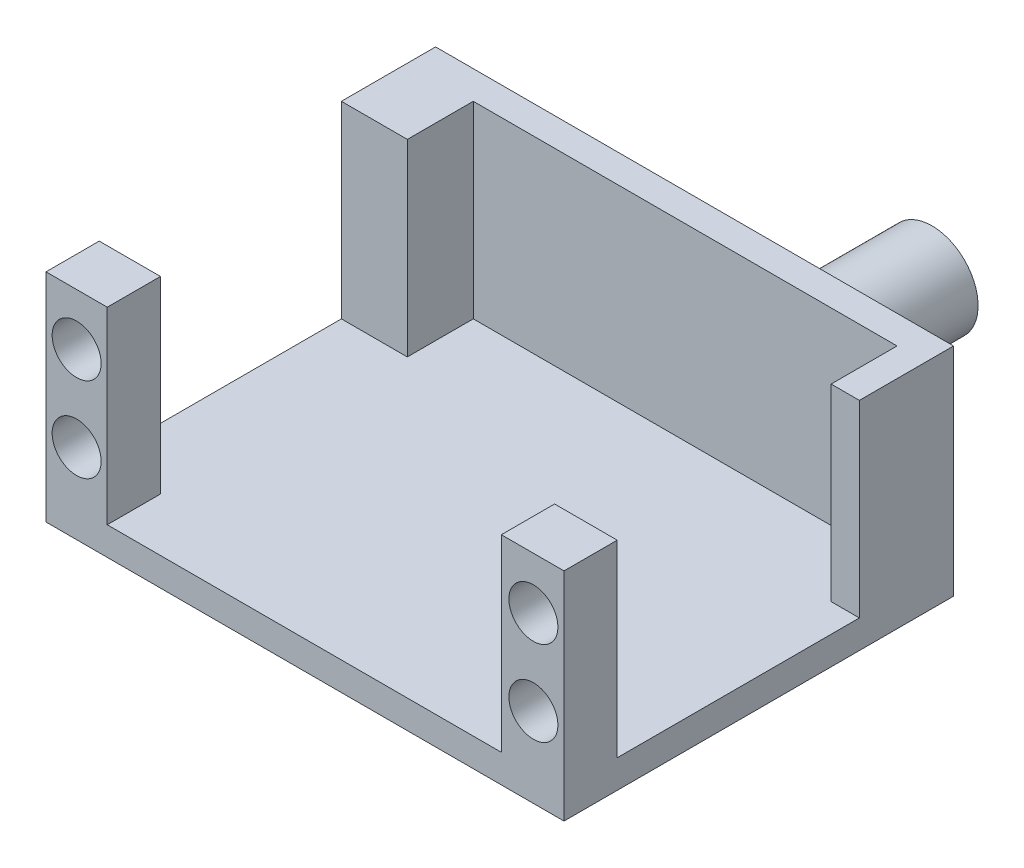
ISO-10303-21;
HEADER;
FILE_DESCRIPTION(('STEP AP214'),'2;1');
FILE_NAME('part.step','',(''),(''),'','','');
FILE_SCHEMA(('AUTOMOTIVE_DESIGN { 1 0 10303 214 1 1 1 1 }'));
ENDSEC;
DATA;
#1=APPLICATION_CONTEXT('core data for automotive mechanical design processes');
#2=APPLICATION_PROTOCOL_DEFINITION('international standard','automotive_design',2000,#1);
#3=PRODUCT_CONTEXT('',#1,'mechanical');
#4=PRODUCT('Part','Part','',(#3));
#5=PRODUCT_RELATED_PRODUCT_CATEGORY('part','',(#4));
#6=PRODUCT_DEFINITION_FORMATION('','',#4);
#7=PRODUCT_DEFINITION_CONTEXT('part definition',#1,'design');
#8=PRODUCT_DEFINITION('design','',#6,#7);
#9=PRODUCT_DEFINITION_SHAPE('','',#8);
#10=(LENGTH_UNIT() NAMED_UNIT(*) SI_UNIT(.MILLI.,.METRE.));
#11=(NAMED_UNIT(*) PLANE_ANGLE_UNIT() SI_UNIT($,.RADIAN.));
#12=(NAMED_UNIT(*) SI_UNIT($,.STERADIAN.) SOLID_ANGLE_UNIT());
#13=UNCERTAINTY_MEASURE_WITH_UNIT(LENGTH_MEASURE(1.E-05),#10,'distance_accuracy_value','');
#14=(GEOMETRIC_REPRESENTATION_CONTEXT(3) GLOBAL_UNCERTAINTY_ASSIGNED_CONTEXT((#13)) GLOBAL_UNIT_ASSIGNED_CONTEXT((#10,
#11,#12)) REPRESENTATION_CONTEXT('',''));
#15=CARTESIAN_POINT('',(0.,0.,0.));
#16=DIRECTION('',(0.,0.,1.));
#17=DIRECTION('',(1.,0.,0.));
#18=AXIS2_PLACEMENT_3D('',#15,#16,#17);
#19=CARTESIAN_POINT('',(0.,3.,0.));
#20=DIRECTION('',(0.,-1.,0.));
#21=DIRECTION('',(0.,0.,-1.));
#22=AXIS2_PLACEMENT_3D('',#19,#20,#21);
#23=PLANE('',#22);
#24=DIRECTION('',(1.,0.,0.));
#25=VECTOR('',#24,1.);
#26=CARTESIAN_POINT('',(27.49,3.,-7.675));
#27=LINE('',#26,#25);
#28=CARTESIAN_POINT('',(24.49,3.,-7.675));
#29=VERTEX_POINT('',#28);
#30=CARTESIAN_POINT('',(27.49,3.,-7.675));
#31=VERTEX_POINT('',#30);
#32=EDGE_CURVE('E54',#29,#31,#27,.T.);
#33=ORIENTED_EDGE('',*,*,#32,.F.);
#34=DIRECTION('',(0.,0.,1.));
#35=VECTOR('',#34,1.);
#36=CARTESIAN_POINT('',(24.49,3.,-14.675));
#37=LINE('',#36,#35);
#38=CARTESIAN_POINT('',(24.49,3.,-14.675));
#39=VERTEX_POINT('',#38);
#40=EDGE_CURVE('E56',#39,#29,#37,.T.);
#41=ORIENTED_EDGE('',*,*,#40,.F.);
#42=DIRECTION('',(1.,0.,0.));
#43=VECTOR('',#42,1.);
#44=CARTESIAN_POINT('',(-20.49,3.,-14.675));
#45=LINE('',#44,#43);
#46=CARTESIAN_POINT('',(-20.49,3.,-14.675));
#47=VERTEX_POINT('',#46);
#48=EDGE_CURVE('E208',#47,#39,#45,.T.);
#49=ORIENTED_EDGE('',*,*,#48,.F.);
#50=DIRECTION('',(0.,0.,-1.));
#51=VECTOR('',#50,1.);
#52=CARTESIAN_POINT('',(-20.49,3.,-7.675));
#53=LINE('',#52,#51);
#54=CARTESIAN_POINT('',(-20.49,3.,-7.675));
#55=VERTEX_POINT('',#54);
#56=EDGE_CURVE('E214',#55,#47,#53,.T.);
#57=ORIENTED_EDGE('',*,*,#56,.F.);
#58=DIRECTION('',(1.,0.,0.));
#59=VECTOR('',#58,1.);
#60=CARTESIAN_POINT('',(-27.49,3.,-7.675));
#61=LINE('',#60,#59);
#62=CARTESIAN_POINT('',(-27.49,3.,-7.675));
#63=VERTEX_POINT('',#62);
#64=EDGE_CURVE('E180',#63,#55,#61,.T.);
#65=ORIENTED_EDGE('',*,*,#64,.F.);
#66=DIRECTION('',(0.,0.,1.));
#67=VECTOR('',#66,1.);
#68=CARTESIAN_POINT('',(-27.49,3.,23.675));
#69=LINE('',#68,#67);
#70=CARTESIAN_POINT('',(-27.49,3.,18.025));
#71=VERTEX_POINT('',#70);
#72=EDGE_CURVE('E256',#63,#71,#69,.T.);
#73=ORIENTED_EDGE('',*,*,#72,.T.);
#74=DIRECTION('',(-1.,0.,0.));
#75=VECTOR('',#74,1.);
#76=CARTESIAN_POINT('',(-27.49,3.,18.025));
#77=LINE('',#76,#75);
#78=CARTESIAN_POINT('',(-20.99,3.,18.025));
#79=VERTEX_POINT('',#78);
#80=EDGE_CURVE('E238',#79,#71,#77,.T.);
#81=ORIENTED_EDGE('',*,*,#80,.F.);
#82=DIRECTION('',(0.,0.,-1.));
#83=VECTOR('',#82,1.);
#84=CARTESIAN_POINT('',(-20.99,3.,23.675));
#85=LINE('',#84,#83);
#86=CARTESIAN_POINT('',(-20.99,3.,23.675));
#87=VERTEX_POINT('',#86);
#88=EDGE_CURVE('E169',#87,#79,#85,.T.);
#89=ORIENTED_EDGE('',*,*,#88,.F.);
#90=DIRECTION('',(1.,0.,0.));
#91=VECTOR('',#90,1.);
#92=CARTESIAN_POINT('',(-27.49,3.,23.675));
#93=LINE('',#92,#91);
#94=CARTESIAN_POINT('',(20.84,3.,23.675));
#95=VERTEX_POINT('',#94);
#96=EDGE_CURVE('E151',#87,#95,#93,.T.);
#97=ORIENTED_EDGE('',*,*,#96,.T.);
#98=DIRECTION('',(0.,0.,1.));
#99=VECTOR('',#98,1.);
#100=CARTESIAN_POINT('',(20.84,3.,23.675));
#101=LINE('',#100,#99);
#102=CARTESIAN_POINT('',(20.84,3.,18.025));
#103=VERTEX_POINT('',#102);
#104=EDGE_CURVE('E150',#103,#95,#101,.T.);
#105=ORIENTED_EDGE('',*,*,#104,.F.);
#106=DIRECTION('',(-1.,0.,0.));
#107=VECTOR('',#106,1.);
#108=CARTESIAN_POINT('',(27.49,3.,18.025));
#109=LINE('',#108,#107);
#110=CARTESIAN_POINT('',(27.49,3.,18.025));
#111=VERTEX_POINT('',#110);
#112=EDGE_CURVE('E152',#111,#103,#109,.T.);
#113=ORIENTED_EDGE('',*,*,#112,.F.);
#114=DIRECTION('',(0.,0.,-1.));
#115=VECTOR('',#114,1.);
#116=CARTESIAN_POINT('',(27.49,3.,23.675));
#117=LINE('',#116,#115);
#118=EDGE_CURVE('E257',#111,#31,#117,.T.);
#119=ORIENTED_EDGE('',*,*,#118,.T.);
#120=EDGE_LOOP('',(#33,#41,#49,#57,#65,#73,#81,#89,#97,#105,#113,#119));
#121=FACE_BOUND('',#120,.T.);
#122=ADVANCED_FACE('F39',(#121),#23,.F.);
#123=CARTESIAN_POINT('',(27.49,3.,23.675));
#124=DIRECTION('',(-1.,0.,0.));
#125=DIRECTION('',(0.,0.,1.));
#126=AXIS2_PLACEMENT_3D('',#123,#124,#125);
#127=PLANE('',#126);
#128=DIRECTION('',(0.,0.,-1.));
#129=VECTOR('',#128,1.);
#130=CARTESIAN_POINT('',(27.49,0.,23.675));
#131=LINE('',#130,#129);
#132=CARTESIAN_POINT('',(27.49,0.,23.675));
#133=VERTEX_POINT('',#132);
#134=CARTESIAN_POINT('',(27.49,0.,-17.675));
#135=VERTEX_POINT('',#134);
#136=EDGE_CURVE('E259',#133,#135,#131,.T.);
#137=ORIENTED_EDGE('',*,*,#136,.T.);
#138=DIRECTION('',(0.,-1.,0.));
#139=VECTOR('',#138,1.);
#140=CARTESIAN_POINT('',(27.49,3.,-17.675));
#141=LINE('',#140,#139);
#142=CARTESIAN_POINT('',(27.49,23.,-17.675));
#143=VERTEX_POINT('',#142);
#144=EDGE_CURVE('E43',#143,#135,#141,.T.);
#145=ORIENTED_EDGE('',*,*,#144,.F.);
#146=DIRECTION('',(0.,0.,-1.));
#147=VECTOR('',#146,1.);
#148=CARTESIAN_POINT('',(27.49,23.,-17.675));
#149=LINE('',#148,#147);
#150=CARTESIAN_POINT('',(27.49,23.,-7.675));
#151=VERTEX_POINT('',#150);
#152=EDGE_CURVE('E216',#151,#143,#149,.T.);
#153=ORIENTED_EDGE('',*,*,#152,.F.);
#154=DIRECTION('',(0.,-1.,0.));
#155=VECTOR('',#154,1.);
#156=CARTESIAN_POINT('',(27.49,23.,-7.675));
#157=LINE('',#156,#155);
#158=EDGE_CURVE('E205',#151,#31,#157,.T.);
#159=ORIENTED_EDGE('',*,*,#158,.T.);
#160=ORIENTED_EDGE('',*,*,#118,.F.);
#161=DIRECTION('',(0.,-1.,0.));
#162=VECTOR('',#161,1.);
#163=CARTESIAN_POINT('',(27.49,23.,18.025));
#164=LINE('',#163,#162);
#165=CARTESIAN_POINT('',(27.49,23.,18.025));
#166=VERTEX_POINT('',#165);
#167=EDGE_CURVE('E166',#166,#111,#164,.T.);
#168=ORIENTED_EDGE('',*,*,#167,.F.);
#169=DIRECTION('',(0.,0.,-1.));
#170=VECTOR('',#169,1.);
#171=CARTESIAN_POINT('',(27.49,23.,23.675));
#172=LINE('',#171,#170);
#173=CARTESIAN_POINT('',(27.49,23.,23.675));
#174=VERTEX_POINT('',#173);
#175=EDGE_CURVE('E156',#174,#166,#172,.T.);
#176=ORIENTED_EDGE('',*,*,#175,.F.);
#177=DIRECTION('',(0.,-1.,0.));
#178=VECTOR('',#177,1.);
#179=CARTESIAN_POINT('',(27.49,3.,23.675));
#180=LINE('',#179,#178);
#181=EDGE_CURVE('E261',#174,#133,#180,.T.);
#182=ORIENTED_EDGE('',*,*,#181,.T.);
#183=EDGE_LOOP('',(#137,#145,#153,#159,#160,#168,#176,#182));
#184=FACE_BOUND('',#183,.T.);
#185=ADVANCED_FACE('F41',(#184),#127,.F.);
#186=CARTESIAN_POINT('',(-27.49,3.,-17.675));
#187=DIRECTION('',(0.,0.,1.));
#188=DIRECTION('',(1.,0.,0.));
#189=AXIS2_PLACEMENT_3D('',#186,#187,#188);
#190=PLANE('',#189);
#191=CARTESIAN_POINT('',(10.19,13.,-17.675));
#192=DIRECTION('',(0.,0.,-1.));
#193=DIRECTION('',(-1.,0.,0.));
#194=AXIS2_PLACEMENT_3D('',#191,#192,#193);
#195=CIRCLE('',#194,4.9);
#196=CARTESIAN_POINT('',(5.29,13.,-17.675));
#197=VERTEX_POINT('',#196);
#198=EDGE_CURVE('E11',#197,#197,#195,.T.);
#199=ORIENTED_EDGE('',*,*,#198,.F.);
#200=EDGE_LOOP('',(#199));
#201=FACE_BOUND('',#200,.T.);
#202=DIRECTION('',(-1.,0.,0.));
#203=VECTOR('',#202,1.);
#204=CARTESIAN_POINT('',(-27.49,0.,-17.675));
#205=LINE('',#204,#203);
#206=CARTESIAN_POINT('',(-27.49,0.,-17.675));
#207=VERTEX_POINT('',#206);
#208=EDGE_CURVE('E269',#135,#207,#205,.T.);
#209=ORIENTED_EDGE('',*,*,#208,.T.);
#210=DIRECTION('',(0.,-1.,0.));
#211=VECTOR('',#210,1.);
#212=CARTESIAN_POINT('',(-27.49,3.,-17.675));
#213=LINE('',#212,#211);
#214=CARTESIAN_POINT('',(-27.49,23.,-17.675));
#215=VERTEX_POINT('',#214);
#216=EDGE_CURVE('E278',#215,#207,#213,.T.);
#217=ORIENTED_EDGE('',*,*,#216,.F.);
#218=DIRECTION('',(-1.,0.,0.));
#219=VECTOR('',#218,1.);
#220=CARTESIAN_POINT('',(-27.49,23.,-17.675));
#221=LINE('',#220,#219);
#222=EDGE_CURVE('E207',#143,#215,#221,.T.);
#223=ORIENTED_EDGE('',*,*,#222,.F.);
#224=ORIENTED_EDGE('',*,*,#144,.T.);
#225=EDGE_LOOP('',(#209,#217,#223,#224));
#226=FACE_BOUND('',#225,.T.);
#227=ADVANCED_FACE('F281',(#201,#226),#190,.F.);
#228=CARTESIAN_POINT('',(-27.49,3.,23.675));
#229=DIRECTION('',(1.,0.,0.));
#230=DIRECTION('',(0.,0.,-1.));
#231=AXIS2_PLACEMENT_3D('',#228,#229,#230);
#232=PLANE('',#231);
#233=DIRECTION('',(0.,0.,1.));
#234=VECTOR('',#233,1.);
#235=CARTESIAN_POINT('',(-27.49,0.,23.675));
#236=LINE('',#235,#234);
#237=CARTESIAN_POINT('',(-27.49,0.,23.675));
#238=VERTEX_POINT('',#237);
#239=EDGE_CURVE('E266',#207,#238,#236,.T.);
#240=ORIENTED_EDGE('',*,*,#239,.T.);
#241=DIRECTION('',(0.,-1.,0.));
#242=VECTOR('',#241,1.);
#243=CARTESIAN_POINT('',(-27.49,3.,23.675));
#244=LINE('',#243,#242);
#245=CARTESIAN_POINT('',(-27.49,23.,23.675));
#246=VERTEX_POINT('',#245);
#247=EDGE_CURVE('E274',#246,#238,#244,.T.);
#248=ORIENTED_EDGE('',*,*,#247,.F.);
#249=DIRECTION('',(0.,0.,1.));
#250=VECTOR('',#249,1.);
#251=CARTESIAN_POINT('',(-27.49,23.,23.675));
#252=LINE('',#251,#250);
#253=CARTESIAN_POINT('',(-27.49,23.,18.025));
#254=VERTEX_POINT('',#253);
#255=EDGE_CURVE('E234',#254,#246,#252,.T.);
#256=ORIENTED_EDGE('',*,*,#255,.F.);
#257=DIRECTION('',(0.,-1.,0.));
#258=VECTOR('',#257,1.);
#259=CARTESIAN_POINT('',(-27.49,23.,18.025));
#260=LINE('',#259,#258);
#261=EDGE_CURVE('E242',#254,#71,#260,.T.);
#262=ORIENTED_EDGE('',*,*,#261,.T.);
#263=ORIENTED_EDGE('',*,*,#72,.F.);
#264=DIRECTION('',(0.,-1.,0.));
#265=VECTOR('',#264,1.);
#266=CARTESIAN_POINT('',(-27.49,23.,-7.675));
#267=LINE('',#266,#265);
#268=CARTESIAN_POINT('',(-27.49,23.,-7.675));
#269=VERTEX_POINT('',#268);
#270=EDGE_CURVE('E190',#269,#63,#267,.T.);
#271=ORIENTED_EDGE('',*,*,#270,.F.);
#272=DIRECTION('',(0.,0.,1.));
#273=VECTOR('',#272,1.);
#274=CARTESIAN_POINT('',(-27.49,23.,-7.675));
#275=LINE('',#274,#273);
#276=EDGE_CURVE('E206',#215,#269,#275,.T.);
#277=ORIENTED_EDGE('',*,*,#276,.F.);
#278=ORIENTED_EDGE('',*,*,#216,.T.);
#279=EDGE_LOOP('',(#240,#248,#256,#262,#263,#271,#277,#278));
#280=FACE_BOUND('',#279,.T.);
#281=ADVANCED_FACE('F292',(#280),#232,.F.);
#282=CARTESIAN_POINT('',(-27.49,3.,23.675));
#283=DIRECTION('',(0.,0.,-1.));
#284=DIRECTION('',(-1.,0.,0.));
#285=AXIS2_PLACEMENT_3D('',#282,#283,#284);
#286=PLANE('',#285);
#287=CARTESIAN_POINT('',(-24.24,8.5,23.675));
#288=DIRECTION('',(0.,0.,1.));
#289=DIRECTION('',(1.,0.,0.));
#290=AXIS2_PLACEMENT_3D('',#287,#288,#289);
#291=CIRCLE('',#290,2.6);
#292=CARTESIAN_POINT('',(-21.64,8.5,23.675));
#293=VERTEX_POINT('',#292);
#294=EDGE_CURVE('E484',#293,#293,#291,.T.);
#295=ORIENTED_EDGE('',*,*,#294,.F.);
#296=EDGE_LOOP('',(#295));
#297=FACE_BOUND('',#296,.T.);
#298=CARTESIAN_POINT('',(24.24,17.5,23.675));
#299=DIRECTION('',(0.,0.,1.));
#300=DIRECTION('',(1.,0.,0.));
#301=AXIS2_PLACEMENT_3D('',#298,#299,#300);
#302=CIRCLE('',#301,2.6);
#303=CARTESIAN_POINT('',(26.84,17.5,23.675));
#304=VERTEX_POINT('',#303);
#305=EDGE_CURVE('E488',#304,#304,#302,.T.);
#306=ORIENTED_EDGE('',*,*,#305,.F.);
#307=EDGE_LOOP('',(#306));
#308=FACE_BOUND('',#307,.T.);
#309=CARTESIAN_POINT('',(24.24,8.5,23.675));
#310=DIRECTION('',(0.,0.,1.));
#311=DIRECTION('',(1.,0.,0.));
#312=AXIS2_PLACEMENT_3D('',#309,#310,#311);
#313=CIRCLE('',#312,2.6);
#314=CARTESIAN_POINT('',(26.84,8.5,23.675));
#315=VERTEX_POINT('',#314);
#316=EDGE_CURVE('E494',#315,#315,#313,.T.);
#317=ORIENTED_EDGE('',*,*,#316,.F.);
#318=EDGE_LOOP('',(#317));
#319=FACE_BOUND('',#318,.T.);
#320=CARTESIAN_POINT('',(-24.24,17.5,23.675));
#321=DIRECTION('',(0.,0.,1.));
#322=DIRECTION('',(1.,0.,0.));
#323=AXIS2_PLACEMENT_3D('',#320,#321,#322);
#324=CIRCLE('',#323,2.6);
#325=CARTESIAN_POINT('',(-21.64,17.5,23.675));
#326=VERTEX_POINT('',#325);
#327=EDGE_CURVE('E486',#326,#326,#324,.T.);
#328=ORIENTED_EDGE('',*,*,#327,.F.);
#329=EDGE_LOOP('',(#328));
#330=FACE_BOUND('',#329,.T.);
#331=DIRECTION('',(1.,0.,0.));
#332=VECTOR('',#331,1.);
#333=CARTESIAN_POINT('',(-27.49,0.,23.675));
#334=LINE('',#333,#332);
#335=EDGE_CURVE('E262',#238,#133,#334,.T.);
#336=ORIENTED_EDGE('',*,*,#335,.T.);
#337=ORIENTED_EDGE('',*,*,#181,.F.);
#338=DIRECTION('',(1.,0.,0.));
#339=VECTOR('',#338,1.);
#340=CARTESIAN_POINT('',(27.49,23.,23.675));
#341=LINE('',#340,#339);
#342=CARTESIAN_POINT('',(20.84,23.,23.675));
#343=VERTEX_POINT('',#342);
#344=EDGE_CURVE('E174',#343,#174,#341,.T.);
#345=ORIENTED_EDGE('',*,*,#344,.F.);
#346=DIRECTION('',(0.,-1.,0.));
#347=VECTOR('',#346,1.);
#348=CARTESIAN_POINT('',(20.84,23.,23.675));
#349=LINE('',#348,#347);
#350=EDGE_CURVE('E173',#343,#95,#349,.T.);
#351=ORIENTED_EDGE('',*,*,#350,.T.);
#352=ORIENTED_EDGE('',*,*,#96,.F.);
#353=DIRECTION('',(0.,-1.,0.));
#354=VECTOR('',#353,1.);
#355=CARTESIAN_POINT('',(-20.99,23.,23.675));
#356=LINE('',#355,#354);
#357=CARTESIAN_POINT('',(-20.99,23.,23.675));
#358=VERTEX_POINT('',#357);
#359=EDGE_CURVE('E251',#358,#87,#356,.T.);
#360=ORIENTED_EDGE('',*,*,#359,.F.);
#361=DIRECTION('',(1.,0.,0.));
#362=VECTOR('',#361,1.);
#363=CARTESIAN_POINT('',(-27.49,23.,23.675));
#364=LINE('',#363,#362);
#365=EDGE_CURVE('E240',#246,#358,#364,.T.);
#366=ORIENTED_EDGE('',*,*,#365,.F.);
#367=ORIENTED_EDGE('',*,*,#247,.T.);
#368=EDGE_LOOP('',(#336,#337,#345,#351,#352,#360,#366,#367));
#369=FACE_BOUND('',#368,.T.);
#370=ADVANCED_FACE('F298',(#297,#308,#319,#330,#369),#286,.F.);
#371=CARTESIAN_POINT('',(0.,0.,0.));
#372=DIRECTION('',(0.,-1.,0.));
#373=DIRECTION('',(0.,0.,-1.));
#374=AXIS2_PLACEMENT_3D('',#371,#372,#373);
#375=PLANE('',#374);
#376=ORIENTED_EDGE('',*,*,#136,.F.);
#377=ORIENTED_EDGE('',*,*,#335,.F.);
#378=ORIENTED_EDGE('',*,*,#239,.F.);
#379=ORIENTED_EDGE('',*,*,#208,.F.);
#380=EDGE_LOOP('',(#376,#377,#378,#379));
#381=FACE_BOUND('',#380,.T.);
#382=ADVANCED_FACE('F293',(#381),#375,.T.);
#383=CARTESIAN_POINT('',(-20.99,23.,23.675));
#384=DIRECTION('',(-1.,0.,0.));
#385=DIRECTION('',(0.,0.,1.));
#386=AXIS2_PLACEMENT_3D('',#383,#384,#385);
#387=PLANE('',#386);
#388=ORIENTED_EDGE('',*,*,#88,.T.);
#389=DIRECTION('',(0.,-1.,0.));
#390=VECTOR('',#389,1.);
#391=CARTESIAN_POINT('',(-20.99,23.,18.025));
#392=LINE('',#391,#390);
#393=CARTESIAN_POINT('',(-20.99,23.,18.025));
#394=VERTEX_POINT('',#393);
#395=EDGE_CURVE('E252',#394,#79,#392,.T.);
#396=ORIENTED_EDGE('',*,*,#395,.F.);
#397=DIRECTION('',(0.,0.,-1.));
#398=VECTOR('',#397,1.);
#399=CARTESIAN_POINT('',(-20.99,23.,23.675));
#400=LINE('',#399,#398);
#401=EDGE_CURVE('E239',#358,#394,#400,.T.);
#402=ORIENTED_EDGE('',*,*,#401,.F.);
#403=ORIENTED_EDGE('',*,*,#359,.T.);
#404=EDGE_LOOP('',(#388,#396,#402,#403));
#405=FACE_BOUND('',#404,.T.);
#406=ADVANCED_FACE('F307',(#405),#387,.F.);
#407=CARTESIAN_POINT('',(-27.49,23.,18.025));
#408=DIRECTION('',(0.,0.,1.));
#409=DIRECTION('',(1.,0.,0.));
#410=AXIS2_PLACEMENT_3D('',#407,#408,#409);
#411=PLANE('',#410);
#412=CARTESIAN_POINT('',(-24.24,8.5,18.025));
#413=DIRECTION('',(0.,0.,1.));
#414=DIRECTION('',(1.,0.,0.));
#415=AXIS2_PLACEMENT_3D('',#412,#413,#414);
#416=CIRCLE('',#415,2.6);
#417=CARTESIAN_POINT('',(-21.64,8.5,18.025));
#418=VERTEX_POINT('',#417);
#419=EDGE_CURVE('E483',#418,#418,#416,.F.);
#420=ORIENTED_EDGE('',*,*,#419,.F.);
#421=EDGE_LOOP('',(#420));
#422=FACE_BOUND('',#421,.T.);
#423=CARTESIAN_POINT('',(-24.24,17.5,18.025));
#424=DIRECTION('',(0.,0.,1.));
#425=DIRECTION('',(1.,0.,0.));
#426=AXIS2_PLACEMENT_3D('',#423,#424,#425);
#427=CIRCLE('',#426,2.6);
#428=CARTESIAN_POINT('',(-21.64,17.5,18.025));
#429=VERTEX_POINT('',#428);
#430=EDGE_CURVE('E501',#429,#429,#427,.F.);
#431=ORIENTED_EDGE('',*,*,#430,.F.);
#432=EDGE_LOOP('',(#431));
#433=FACE_BOUND('',#432,.T.);
#434=ORIENTED_EDGE('',*,*,#80,.T.);
#435=ORIENTED_EDGE('',*,*,#261,.F.);
#436=DIRECTION('',(-1.,0.,0.));
#437=VECTOR('',#436,1.);
#438=CARTESIAN_POINT('',(-27.49,23.,18.025));
#439=LINE('',#438,#437);
#440=EDGE_CURVE('E245',#394,#254,#439,.T.);
#441=ORIENTED_EDGE('',*,*,#440,.F.);
#442=ORIENTED_EDGE('',*,*,#395,.T.);
#443=EDGE_LOOP('',(#434,#435,#441,#442));
#444=FACE_BOUND('',#443,.T.);
#445=ADVANCED_FACE('F306',(#422,#433,#444),#411,.F.);
#446=CARTESIAN_POINT('',(0.,23.,0.));
#447=DIRECTION('',(0.,-1.,0.));
#448=DIRECTION('',(0.,0.,-1.));
#449=AXIS2_PLACEMENT_3D('',#446,#447,#448);
#450=PLANE('',#449);
#451=ORIENTED_EDGE('',*,*,#255,.T.);
#452=ORIENTED_EDGE('',*,*,#365,.T.);
#453=ORIENTED_EDGE('',*,*,#401,.T.);
#454=ORIENTED_EDGE('',*,*,#440,.T.);
#455=EDGE_LOOP('',(#451,#452,#453,#454));
#456=FACE_BOUND('',#455,.T.);
#457=ADVANCED_FACE('F297',(#456),#450,.F.);
#458=CARTESIAN_POINT('',(27.49,23.,18.025));
#459=DIRECTION('',(0.,0.,1.));
#460=DIRECTION('',(1.,0.,0.));
#461=AXIS2_PLACEMENT_3D('',#458,#459,#460);
#462=PLANE('',#461);
#463=CARTESIAN_POINT('',(24.24,17.5,18.025));
#464=DIRECTION('',(0.,0.,1.));
#465=DIRECTION('',(1.,0.,0.));
#466=AXIS2_PLACEMENT_3D('',#463,#464,#465);
#467=CIRCLE('',#466,2.6);
#468=CARTESIAN_POINT('',(26.84,17.5,18.025));
#469=VERTEX_POINT('',#468);
#470=EDGE_CURVE('E493',#469,#469,#467,.F.);
#471=ORIENTED_EDGE('',*,*,#470,.F.);
#472=EDGE_LOOP('',(#471));
#473=FACE_BOUND('',#472,.T.);
#474=CARTESIAN_POINT('',(24.24,8.5,18.025));
#475=DIRECTION('',(0.,0.,1.));
#476=DIRECTION('',(1.,0.,0.));
#477=AXIS2_PLACEMENT_3D('',#474,#475,#476);
#478=CIRCLE('',#477,2.6);
#479=CARTESIAN_POINT('',(26.84,8.5,18.025));
#480=VERTEX_POINT('',#479);
#481=EDGE_CURVE('E514',#480,#480,#478,.F.);
#482=ORIENTED_EDGE('',*,*,#481,.F.);
#483=EDGE_LOOP('',(#482));
#484=FACE_BOUND('',#483,.T.);
#485=ORIENTED_EDGE('',*,*,#112,.T.);
#486=DIRECTION('',(0.,-1.,0.));
#487=VECTOR('',#486,1.);
#488=CARTESIAN_POINT('',(20.84,23.,18.025));
#489=LINE('',#488,#487);
#490=CARTESIAN_POINT('',(20.84,23.,18.025));
#491=VERTEX_POINT('',#490);
#492=EDGE_CURVE('E164',#491,#103,#489,.T.);
#493=ORIENTED_EDGE('',*,*,#492,.F.);
#494=DIRECTION('',(-1.,0.,0.));
#495=VECTOR('',#494,1.);
#496=CARTESIAN_POINT('',(27.49,23.,18.025));
#497=LINE('',#496,#495);
#498=EDGE_CURVE('E182',#166,#491,#497,.T.);
#499=ORIENTED_EDGE('',*,*,#498,.F.);
#500=ORIENTED_EDGE('',*,*,#167,.T.);
#501=EDGE_LOOP('',(#485,#493,#499,#500));
#502=FACE_BOUND('',#501,.T.);
#503=ADVANCED_FACE('F165',(#473,#484,#502),#462,.F.);
#504=CARTESIAN_POINT('',(20.84,23.,23.675));
#505=DIRECTION('',(1.,0.,0.));
#506=DIRECTION('',(0.,0.,-1.));
#507=AXIS2_PLACEMENT_3D('',#504,#505,#506);
#508=PLANE('',#507);
#509=ORIENTED_EDGE('',*,*,#104,.T.);
#510=ORIENTED_EDGE('',*,*,#350,.F.);
#511=DIRECTION('',(0.,0.,1.));
#512=VECTOR('',#511,1.);
#513=CARTESIAN_POINT('',(20.84,23.,23.675));
#514=LINE('',#513,#512);
#515=EDGE_CURVE('E175',#491,#343,#514,.T.);
#516=ORIENTED_EDGE('',*,*,#515,.F.);
#517=ORIENTED_EDGE('',*,*,#492,.T.);
#518=EDGE_LOOP('',(#509,#510,#516,#517));
#519=FACE_BOUND('',#518,.T.);
#520=ADVANCED_FACE('F171',(#519),#508,.F.);
#521=CARTESIAN_POINT('',(0.,23.,0.));
#522=DIRECTION('',(0.,1.,0.));
#523=DIRECTION('',(0.,0.,1.));
#524=AXIS2_PLACEMENT_3D('',#521,#522,#523);
#525=PLANE('',#524);
#526=ORIENTED_EDGE('',*,*,#175,.T.);
#527=ORIENTED_EDGE('',*,*,#498,.T.);
#528=ORIENTED_EDGE('',*,*,#515,.T.);
#529=ORIENTED_EDGE('',*,*,#344,.T.);
#530=EDGE_LOOP('',(#526,#527,#528,#529));
#531=FACE_BOUND('',#530,.T.);
#532=ADVANCED_FACE('F359',(#531),#525,.T.);
#533=CARTESIAN_POINT('',(-27.49,23.,-7.675));
#534=DIRECTION('',(0.,0.,-1.));
#535=DIRECTION('',(-1.,0.,0.));
#536=AXIS2_PLACEMENT_3D('',#533,#534,#535);
#537=PLANE('',#536);
#538=ORIENTED_EDGE('',*,*,#64,.T.);
#539=DIRECTION('',(0.,-1.,0.));
#540=VECTOR('',#539,1.);
#541=CARTESIAN_POINT('',(-20.49,23.,-7.675));
#542=LINE('',#541,#540);
#543=CARTESIAN_POINT('',(-20.49,23.,-7.675));
#544=VERTEX_POINT('',#543);
#545=EDGE_CURVE('E188',#544,#55,#542,.T.);
#546=ORIENTED_EDGE('',*,*,#545,.F.);
#547=DIRECTION('',(1.,0.,0.));
#548=VECTOR('',#547,1.);
#549=CARTESIAN_POINT('',(-27.49,23.,-7.675));
#550=LINE('',#549,#548);
#551=EDGE_CURVE('E229',#269,#544,#550,.T.);
#552=ORIENTED_EDGE('',*,*,#551,.F.);
#553=ORIENTED_EDGE('',*,*,#270,.T.);
#554=EDGE_LOOP('',(#538,#546,#552,#553));
#555=FACE_BOUND('',#554,.T.);
#556=ADVANCED_FACE('F361',(#555),#537,.F.);
#557=CARTESIAN_POINT('',(-20.49,23.,-7.675));
#558=DIRECTION('',(-1.,0.,0.));
#559=DIRECTION('',(0.,0.,1.));
#560=AXIS2_PLACEMENT_3D('',#557,#558,#559);
#561=PLANE('',#560);
#562=ORIENTED_EDGE('',*,*,#56,.T.);
#563=DIRECTION('',(0.,-1.,0.));
#564=VECTOR('',#563,1.);
#565=CARTESIAN_POINT('',(-20.49,23.,-14.675));
#566=LINE('',#565,#564);
#567=CARTESIAN_POINT('',(-20.49,23.,-14.675));
#568=VERTEX_POINT('',#567);
#569=EDGE_CURVE('E195',#568,#47,#566,.T.);
#570=ORIENTED_EDGE('',*,*,#569,.F.);
#571=DIRECTION('',(0.,0.,-1.));
#572=VECTOR('',#571,1.);
#573=CARTESIAN_POINT('',(-20.49,23.,-7.675));
#574=LINE('',#573,#572);
#575=EDGE_CURVE('E226',#544,#568,#574,.T.);
#576=ORIENTED_EDGE('',*,*,#575,.F.);
#577=ORIENTED_EDGE('',*,*,#545,.T.);
#578=EDGE_LOOP('',(#562,#570,#576,#577));
#579=FACE_BOUND('',#578,.T.);
#580=ADVANCED_FACE('F370',(#579),#561,.F.);
#581=CARTESIAN_POINT('',(-20.49,23.,-14.675));
#582=DIRECTION('',(0.,0.,-1.));
#583=DIRECTION('',(-1.,0.,0.));
#584=AXIS2_PLACEMENT_3D('',#581,#582,#583);
#585=PLANE('',#584);
#586=ORIENTED_EDGE('',*,*,#48,.T.);
#587=DIRECTION('',(0.,-1.,0.));
#588=VECTOR('',#587,1.);
#589=CARTESIAN_POINT('',(24.49,23.,-14.675));
#590=LINE('',#589,#588);
#591=CARTESIAN_POINT('',(24.49,23.,-14.675));
#592=VERTEX_POINT('',#591);
#593=EDGE_CURVE('E199',#592,#39,#590,.T.);
#594=ORIENTED_EDGE('',*,*,#593,.F.);
#595=DIRECTION('',(1.,0.,0.));
#596=VECTOR('',#595,1.);
#597=CARTESIAN_POINT('',(-20.49,23.,-14.675));
#598=LINE('',#597,#596);
#599=EDGE_CURVE('E228',#568,#592,#598,.T.);
#600=ORIENTED_EDGE('',*,*,#599,.F.);
#601=ORIENTED_EDGE('',*,*,#569,.T.);
#602=EDGE_LOOP('',(#586,#594,#600,#601));
#603=FACE_BOUND('',#602,.T.);
#604=ADVANCED_FACE('F371',(#603),#585,.F.);
#605=CARTESIAN_POINT('',(24.49,23.,-14.675));
#606=DIRECTION('',(1.,0.,0.));
#607=DIRECTION('',(0.,0.,-1.));
#608=AXIS2_PLACEMENT_3D('',#605,#606,#607);
#609=PLANE('',#608);
#610=ORIENTED_EDGE('',*,*,#40,.T.);
#611=DIRECTION('',(0.,-1.,0.));
#612=VECTOR('',#611,1.);
#613=CARTESIAN_POINT('',(24.49,23.,-7.675));
#614=LINE('',#613,#612);
#615=CARTESIAN_POINT('',(24.49,23.,-7.675));
#616=VERTEX_POINT('',#615);
#617=EDGE_CURVE('E198',#616,#29,#614,.T.);
#618=ORIENTED_EDGE('',*,*,#617,.F.);
#619=DIRECTION('',(0.,0.,1.));
#620=VECTOR('',#619,1.);
#621=CARTESIAN_POINT('',(24.49,23.,-14.675));
#622=LINE('',#621,#620);
#623=EDGE_CURVE('E221',#592,#616,#622,.T.);
#624=ORIENTED_EDGE('',*,*,#623,.F.);
#625=ORIENTED_EDGE('',*,*,#593,.T.);
#626=EDGE_LOOP('',(#610,#618,#624,#625));
#627=FACE_BOUND('',#626,.T.);
#628=ADVANCED_FACE('F374',(#627),#609,.F.);
#629=CARTESIAN_POINT('',(27.49,23.,-7.675));
#630=DIRECTION('',(0.,0.,-1.));
#631=DIRECTION('',(-1.,0.,0.));
#632=AXIS2_PLACEMENT_3D('',#629,#630,#631);
#633=PLANE('',#632);
#634=ORIENTED_EDGE('',*,*,#32,.T.);
#635=ORIENTED_EDGE('',*,*,#158,.F.);
#636=DIRECTION('',(1.,0.,0.));
#637=VECTOR('',#636,1.);
#638=CARTESIAN_POINT('',(27.49,23.,-7.675));
#639=LINE('',#638,#637);
#640=EDGE_CURVE('E224',#616,#151,#639,.T.);
#641=ORIENTED_EDGE('',*,*,#640,.F.);
#642=ORIENTED_EDGE('',*,*,#617,.T.);
#643=EDGE_LOOP('',(#634,#635,#641,#642));
#644=FACE_BOUND('',#643,.T.);
#645=ADVANCED_FACE('F346',(#644),#633,.F.);
#646=CARTESIAN_POINT('',(0.,23.,0.));
#647=DIRECTION('',(0.,-1.,0.));
#648=DIRECTION('',(0.,0.,-1.));
#649=AXIS2_PLACEMENT_3D('',#646,#647,#648);
#650=PLANE('',#649);
#651=ORIENTED_EDGE('',*,*,#276,.T.);
#652=ORIENTED_EDGE('',*,*,#551,.T.);
#653=ORIENTED_EDGE('',*,*,#575,.T.);
#654=ORIENTED_EDGE('',*,*,#599,.T.);
#655=ORIENTED_EDGE('',*,*,#623,.T.);
#656=ORIENTED_EDGE('',*,*,#640,.T.);
#657=ORIENTED_EDGE('',*,*,#152,.T.);
#658=ORIENTED_EDGE('',*,*,#222,.T.);
#659=EDGE_LOOP('',(#651,#652,#653,#654,#655,#656,#657,#658));
#660=FACE_BOUND('',#659,.T.);
#661=ADVANCED_FACE('F338',(#660),#650,.F.);
#662=CARTESIAN_POINT('',(10.19,13.,-32.675));
#663=DIRECTION('',(0.,0.,1.));
#664=DIRECTION('',(1.,0.,0.));
#665=AXIS2_PLACEMENT_3D('',#662,#663,#664);
#666=CYLINDRICAL_SURFACE('',#665,4.9);
#667=CARTESIAN_POINT('',(10.19,13.,-32.675));
#668=DIRECTION('',(0.,0.,-1.));
#669=DIRECTION('',(-1.,0.,0.));
#670=AXIS2_PLACEMENT_3D('',#667,#668,#669);
#671=CIRCLE('',#670,4.9);
#672=CARTESIAN_POINT('',(5.29,13.,-32.675));
#673=VERTEX_POINT('',#672);
#674=EDGE_CURVE('E193',#673,#673,#671,.T.);
#675=ORIENTED_EDGE('',*,*,#674,.F.);
#676=EDGE_LOOP('',(#675));
#677=FACE_BOUND('',#676,.T.);
#678=ORIENTED_EDGE('',*,*,#198,.T.);
#679=EDGE_LOOP('',(#678));
#680=FACE_BOUND('',#679,.T.);
#681=ADVANCED_FACE('F336',(#677,#680),#666,.T.);
#682=CARTESIAN_POINT('',(10.19,13.,-32.675));
#683=DIRECTION('',(0.,0.,-1.));
#684=DIRECTION('',(-1.,0.,0.));
#685=AXIS2_PLACEMENT_3D('',#682,#683,#684);
#686=PLANE('',#685);
#687=ORIENTED_EDGE('',*,*,#674,.T.);
#688=EDGE_LOOP('',(#687));
#689=FACE_BOUND('',#688,.T.);
#690=ADVANCED_FACE('F339',(#689),#686,.T.);
#691=CARTESIAN_POINT('',(24.24,8.5,-32.676));
#692=DIRECTION('',(0.,0.,1.));
#693=DIRECTION('',(1.,0.,0.));
#694=AXIS2_PLACEMENT_3D('',#691,#692,#693);
#695=CYLINDRICAL_SURFACE('',#694,2.6);
#696=ORIENTED_EDGE('',*,*,#316,.T.);
#697=EDGE_LOOP('',(#696));
#698=FACE_BOUND('',#697,.T.);
#699=ORIENTED_EDGE('',*,*,#481,.T.);
#700=EDGE_LOOP('',(#699));
#701=FACE_BOUND('',#700,.T.);
#702=ADVANCED_FACE('F347',(#698,#701),#695,.F.);
#703=CARTESIAN_POINT('',(24.24,17.5,-32.676));
#704=DIRECTION('',(0.,0.,1.));
#705=DIRECTION('',(1.,0.,0.));
#706=AXIS2_PLACEMENT_3D('',#703,#704,#705);
#707=CYLINDRICAL_SURFACE('',#706,2.6);
#708=ORIENTED_EDGE('',*,*,#305,.T.);
#709=EDGE_LOOP('',(#708));
#710=FACE_BOUND('',#709,.T.);
#711=ORIENTED_EDGE('',*,*,#470,.T.);
#712=EDGE_LOOP('',(#711));
#713=FACE_BOUND('',#712,.T.);
#714=ADVANCED_FACE('F450',(#710,#713),#707,.F.);
#715=CARTESIAN_POINT('',(-24.24,17.5,-32.676));
#716=DIRECTION('',(0.,0.,1.));
#717=DIRECTION('',(1.,0.,0.));
#718=AXIS2_PLACEMENT_3D('',#715,#716,#717);
#719=CYLINDRICAL_SURFACE('',#718,2.6);
#720=ORIENTED_EDGE('',*,*,#327,.T.);
#721=EDGE_LOOP('',(#720));
#722=FACE_BOUND('',#721,.T.);
#723=ORIENTED_EDGE('',*,*,#430,.T.);
#724=EDGE_LOOP('',(#723));
#725=FACE_BOUND('',#724,.T.);
#726=ADVANCED_FACE('F459',(#722,#725),#719,.F.);
#727=CARTESIAN_POINT('',(-24.24,8.5,-32.676));
#728=DIRECTION('',(0.,0.,1.));
#729=DIRECTION('',(1.,0.,0.));
#730=AXIS2_PLACEMENT_3D('',#727,#728,#729);
#731=CYLINDRICAL_SURFACE('',#730,2.6);
#732=ORIENTED_EDGE('',*,*,#294,.T.);
#733=EDGE_LOOP('',(#732));
#734=FACE_BOUND('',#733,.T.);
#735=ORIENTED_EDGE('',*,*,#419,.T.);
#736=EDGE_LOOP('',(#735));
#737=FACE_BOUND('',#736,.T.);
#738=ADVANCED_FACE('F470',(#734,#737),#731,.F.);
#739=CLOSED_SHELL('',(#122,#185,#227,#281,#370,#382,#406,#445,#457,#503,#520,#532,#556,#580,
#604,#628,#645,#661,#681,#690,#702,#714,#726,#738));
#740=MANIFOLD_SOLID_BREP('B2',#739);
#741=ADVANCED_BREP_SHAPE_REPRESENTATION('',(#18,#740),#14);
#742=SHAPE_DEFINITION_REPRESENTATION(#9,#741);
ENDSEC;
END-ISO-10303-21;
